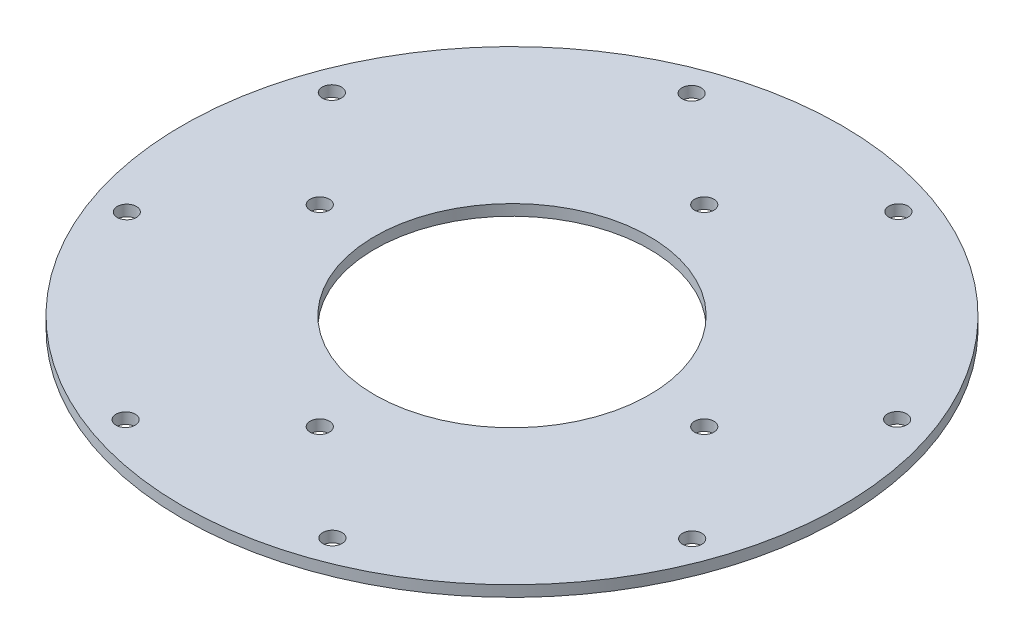
ISO-10303-21;
HEADER;
FILE_DESCRIPTION(('STEP AP214'),'2;1');
FILE_NAME('part.step','',(''),(''),'','','');
FILE_SCHEMA(('AUTOMOTIVE_DESIGN { 1 0 10303 214 1 1 1 1 }'));
ENDSEC;
DATA;
#1=APPLICATION_CONTEXT('core data for automotive mechanical design processes');
#2=APPLICATION_PROTOCOL_DEFINITION('international standard','automotive_design',2000,#1);
#3=PRODUCT_CONTEXT('',#1,'mechanical');
#4=PRODUCT('Part','Part','',(#3));
#5=PRODUCT_RELATED_PRODUCT_CATEGORY('part','',(#4));
#6=PRODUCT_DEFINITION_FORMATION('','',#4);
#7=PRODUCT_DEFINITION_CONTEXT('part definition',#1,'design');
#8=PRODUCT_DEFINITION('design','',#6,#7);
#9=PRODUCT_DEFINITION_SHAPE('','',#8);
#10=(LENGTH_UNIT() NAMED_UNIT(*) SI_UNIT(.MILLI.,.METRE.));
#11=(NAMED_UNIT(*) PLANE_ANGLE_UNIT() SI_UNIT($,.RADIAN.));
#12=(NAMED_UNIT(*) SI_UNIT($,.STERADIAN.) SOLID_ANGLE_UNIT());
#13=UNCERTAINTY_MEASURE_WITH_UNIT(LENGTH_MEASURE(1.E-05),#10,'distance_accuracy_value','');
#14=(GEOMETRIC_REPRESENTATION_CONTEXT(3) GLOBAL_UNCERTAINTY_ASSIGNED_CONTEXT((#13)) GLOBAL_UNIT_ASSIGNED_CONTEXT((#10,
#11,#12)) REPRESENTATION_CONTEXT('',''));
#15=CARTESIAN_POINT('',(0.,0.,0.));
#16=DIRECTION('',(0.,0.,1.));
#17=DIRECTION('',(1.,0.,0.));
#18=AXIS2_PLACEMENT_3D('',#15,#16,#17);
#19=CARTESIAN_POINT('',(0.,2.,0.));
#20=DIRECTION('',(0.,1.,0.));
#21=DIRECTION('',(0.,0.,1.));
#22=AXIS2_PLACEMENT_3D('',#19,#20,#21);
#23=PLANE('',#22);
#24=CARTESIAN_POINT('',(0.,2.,0.));
#25=DIRECTION('',(0.,1.,0.));
#26=DIRECTION('',(0.,0.,1.));
#27=AXIS2_PLACEMENT_3D('',#24,#25,#26);
#28=CIRCLE('',#27,25.);
#29=CARTESIAN_POINT('',(0.,2.,25.));
#30=VERTEX_POINT('',#29);
#31=EDGE_CURVE('E140',#30,#30,#28,.T.);
#32=ORIENTED_EDGE('',*,*,#31,.F.);
#33=EDGE_LOOP('',(#32));
#34=FACE_BOUND('',#33,.T.);
#35=CARTESIAN_POINT('',(0.,2.,-35.));
#36=DIRECTION('',(0.,1.,0.));
#37=DIRECTION('',(0.,0.,1.));
#38=AXIS2_PLACEMENT_3D('',#35,#36,#37);
#39=CIRCLE('',#38,1.75);
#40=CARTESIAN_POINT('',(0.,2.,-33.25));
#41=VERTEX_POINT('',#40);
#42=EDGE_CURVE('E54',#41,#41,#39,.T.);
#43=ORIENTED_EDGE('',*,*,#42,.F.);
#44=EDGE_LOOP('',(#43));
#45=FACE_BOUND('',#44,.T.);
#46=CARTESIAN_POINT('',(35.000000000001,2.,-9.88330434368617E-13));
#47=DIRECTION('',(0.,1.,0.));
#48=DIRECTION('',(0.,0.,1.));
#49=AXIS2_PLACEMENT_3D('',#46,#47,#48);
#50=CIRCLE('',#49,1.75000000000077);
#51=CARTESIAN_POINT('',(35.000000000001,2.,1.74999999999978));
#52=VERTEX_POINT('',#51);
#53=EDGE_CURVE('E147',#52,#52,#50,.T.);
#54=ORIENTED_EDGE('',*,*,#53,.F.);
#55=EDGE_LOOP('',(#54));
#56=FACE_BOUND('',#55,.T.);
#57=CARTESIAN_POINT('',(1.97666086873723E-12,2.,35.));
#58=DIRECTION('',(0.,1.,0.));
#59=DIRECTION('',(0.,0.,1.));
#60=AXIS2_PLACEMENT_3D('',#57,#58,#59);
#61=CIRCLE('',#60,1.75000000000212);
#62=CARTESIAN_POINT('',(1.97666086873723E-12,2.,36.7500000000021));
#63=VERTEX_POINT('',#62);
#64=EDGE_CURVE('E151',#63,#63,#61,.T.);
#65=ORIENTED_EDGE('',*,*,#64,.F.);
#66=EDGE_LOOP('',(#65));
#67=FACE_BOUND('',#66,.T.);
#68=CARTESIAN_POINT('',(-34.999999999999,2.,9.92616698165633E-13));
#69=DIRECTION('',(0.,1.,0.));
#70=DIRECTION('',(0.,0.,1.));
#71=AXIS2_PLACEMENT_3D('',#68,#69,#70);
#72=CIRCLE('',#71,1.75000000000159);
#73=CARTESIAN_POINT('',(-34.999999999999,2.,1.75000000000258));
#74=VERTEX_POINT('',#73);
#75=EDGE_CURVE('E155',#74,#74,#72,.T.);
#76=ORIENTED_EDGE('',*,*,#75,.F.);
#77=EDGE_LOOP('',(#76));
#78=FACE_BOUND('',#77,.T.);
#79=CARTESIAN_POINT('',(-18.7721486762096,2.,51.576054602529));
#80=DIRECTION('',(0.,1.,0.));
#81=DIRECTION('',(0.,0.,1.));
#82=AXIS2_PLACEMENT_3D('',#79,#80,#81);
#83=CIRCLE('',#82,1.75);
#84=CARTESIAN_POINT('',(-18.7721486762096,2.,53.326054602529));
#85=VERTEX_POINT('',#84);
#86=EDGE_CURVE('E74',#85,#85,#83,.T.);
#87=ORIENTED_EDGE('',*,*,#86,.F.);
#88=EDGE_LOOP('',(#87));
#89=FACE_BOUND('',#88,.T.);
#90=CARTESIAN_POINT('',(51.576054602531,2.,18.7721486762105));
#91=DIRECTION('',(0.,1.,0.));
#92=DIRECTION('',(0.,0.,1.));
#93=AXIS2_PLACEMENT_3D('',#90,#91,#92);
#94=CIRCLE('',#93,1.75000000000153);
#95=CARTESIAN_POINT('',(51.576054602531,2.,20.522148676212));
#96=VERTEX_POINT('',#95);
#97=EDGE_CURVE('E86',#96,#96,#94,.T.);
#98=ORIENTED_EDGE('',*,*,#97,.F.);
#99=EDGE_LOOP('',(#98));
#100=FACE_BOUND('',#99,.T.);
#101=CARTESIAN_POINT('',(18.7721486762125,2.,-51.57605460253));
#102=DIRECTION('',(0.,1.,0.));
#103=DIRECTION('',(0.,0.,1.));
#104=AXIS2_PLACEMENT_3D('',#101,#102,#103);
#105=CIRCLE('',#104,1.74999999999994);
#106=CARTESIAN_POINT('',(18.7721486762125,2.,-49.8260546025301));
#107=VERTEX_POINT('',#106);
#108=EDGE_CURVE('E98',#107,#107,#105,.T.);
#109=ORIENTED_EDGE('',*,*,#108,.F.);
#110=EDGE_LOOP('',(#109));
#111=FACE_BOUND('',#110,.T.);
#112=CARTESIAN_POINT('',(-51.5760546025281,2.,-18.7721486762116));
#113=DIRECTION('',(0.,1.,0.));
#114=DIRECTION('',(0.,0.,1.));
#115=AXIS2_PLACEMENT_3D('',#112,#113,#114);
#116=CIRCLE('',#115,1.74999999999817);
#117=CARTESIAN_POINT('',(-51.5760546025281,2.,-17.0221486762134));
#118=VERTEX_POINT('',#117);
#119=EDGE_CURVE('E44',#118,#118,#116,.T.);
#120=ORIENTED_EDGE('',*,*,#119,.F.);
#121=EDGE_LOOP('',(#120));
#122=FACE_BOUND('',#121,.T.);
#123=CARTESIAN_POINT('',(0.,2.,0.));
#124=DIRECTION('',(0.,1.,0.));
#125=DIRECTION('',(0.,0.,1.));
#126=AXIS2_PLACEMENT_3D('',#123,#124,#125);
#127=CIRCLE('',#126,60.);
#128=CARTESIAN_POINT('',(0.,2.,60.));
#129=VERTEX_POINT('',#128);
#130=EDGE_CURVE('E10',#129,#129,#127,.T.);
#131=ORIENTED_EDGE('',*,*,#130,.T.);
#132=EDGE_LOOP('',(#131));
#133=FACE_BOUND('',#132,.T.);
#134=CARTESIAN_POINT('',(-18.7123480321497,2.,-51.4117536833079));
#135=DIRECTION('',(0.,1.,0.));
#136=DIRECTION('',(0.,0.,1.));
#137=AXIS2_PLACEMENT_3D('',#134,#135,#136);
#138=CIRCLE('',#137,1.75);
#139=CARTESIAN_POINT('',(-18.7123480321497,2.,-49.6617536833079));
#140=VERTEX_POINT('',#139);
#141=EDGE_CURVE('E104',#140,#140,#138,.T.);
#142=ORIENTED_EDGE('',*,*,#141,.F.);
#143=EDGE_LOOP('',(#142));
#144=FACE_BOUND('',#143,.T.);
#145=CARTESIAN_POINT('',(51.4117536833088,2.,-18.7123480321517));
#146=DIRECTION('',(0.,1.,0.));
#147=DIRECTION('',(0.,0.,1.));
#148=AXIS2_PLACEMENT_3D('',#145,#146,#147);
#149=CIRCLE('',#148,1.75000000000184);
#150=CARTESIAN_POINT('',(51.4117536833088,2.,-16.9623480321499));
#151=VERTEX_POINT('',#150);
#152=EDGE_CURVE('E92',#151,#151,#149,.T.);
#153=ORIENTED_EDGE('',*,*,#152,.F.);
#154=EDGE_LOOP('',(#153));
#155=FACE_BOUND('',#154,.T.);
#156=CARTESIAN_POINT('',(18.7123480321527,2.,51.4117536833068));
#157=DIRECTION('',(0.,1.,0.));
#158=DIRECTION('',(0.,0.,1.));
#159=AXIS2_PLACEMENT_3D('',#156,#157,#158);
#160=CIRCLE('',#159,1.75000000000352);
#161=CARTESIAN_POINT('',(18.7123480321527,2.,53.1617536833103));
#162=VERTEX_POINT('',#161);
#163=EDGE_CURVE('E80',#162,#162,#160,.T.);
#164=ORIENTED_EDGE('',*,*,#163,.F.);
#165=EDGE_LOOP('',(#164));
#166=FACE_BOUND('',#165,.T.);
#167=CARTESIAN_POINT('',(-51.4117536833059,2.,18.7123480321507));
#168=DIRECTION('',(0.,1.,0.));
#169=DIRECTION('',(0.,0.,1.));
#170=AXIS2_PLACEMENT_3D('',#167,#168,#169);
#171=CIRCLE('',#170,1.75000000000206);
#172=CARTESIAN_POINT('',(-51.4117536833059,2.,20.4623480321527));
#173=VERTEX_POINT('',#172);
#174=EDGE_CURVE('E65',#173,#173,#171,.T.);
#175=ORIENTED_EDGE('',*,*,#174,.F.);
#176=EDGE_LOOP('',(#175));
#177=FACE_BOUND('',#176,.T.);
#178=ADVANCED_FACE('F31',(#34,#45,#56,#67,#78,#89,#100,#111,#122,#133,#144,#155,#166,#177),#23,.T.);
#179=CARTESIAN_POINT('',(0.,0.,0.));
#180=DIRECTION('',(0.,1.,0.));
#181=DIRECTION('',(0.,0.,1.));
#182=AXIS2_PLACEMENT_3D('',#179,#180,#181);
#183=PLANE('',#182);
#184=CARTESIAN_POINT('',(0.,0.,0.));
#185=DIRECTION('',(0.,1.,0.));
#186=DIRECTION('',(0.,0.,1.));
#187=AXIS2_PLACEMENT_3D('',#184,#185,#186);
#188=CIRCLE('',#187,25.);
#189=CARTESIAN_POINT('',(0.,0.,25.));
#190=VERTEX_POINT('',#189);
#191=EDGE_CURVE('E35',#190,#190,#188,.T.);
#192=ORIENTED_EDGE('',*,*,#191,.T.);
#193=EDGE_LOOP('',(#192));
#194=FACE_BOUND('',#193,.T.);
#195=CARTESIAN_POINT('',(0.,0.,-35.));
#196=DIRECTION('',(0.,1.,0.));
#197=DIRECTION('',(0.,0.,1.));
#198=AXIS2_PLACEMENT_3D('',#195,#196,#197);
#199=CIRCLE('',#198,1.75);
#200=CARTESIAN_POINT('',(0.,0.,-33.25));
#201=VERTEX_POINT('',#200);
#202=EDGE_CURVE('E59',#201,#201,#199,.T.);
#203=ORIENTED_EDGE('',*,*,#202,.T.);
#204=EDGE_LOOP('',(#203));
#205=FACE_BOUND('',#204,.T.);
#206=CARTESIAN_POINT('',(35.000000000001,0.,-9.88330434368617E-13));
#207=DIRECTION('',(0.,1.,0.));
#208=DIRECTION('',(0.,0.,1.));
#209=AXIS2_PLACEMENT_3D('',#206,#207,#208);
#210=CIRCLE('',#209,1.75000000000077);
#211=CARTESIAN_POINT('',(35.000000000001,0.,1.74999999999978));
#212=VERTEX_POINT('',#211);
#213=EDGE_CURVE('E57',#212,#212,#210,.T.);
#214=ORIENTED_EDGE('',*,*,#213,.T.);
#215=EDGE_LOOP('',(#214));
#216=FACE_BOUND('',#215,.T.);
#217=CARTESIAN_POINT('',(1.97666086873723E-12,0.,35.));
#218=DIRECTION('',(0.,1.,0.));
#219=DIRECTION('',(0.,0.,1.));
#220=AXIS2_PLACEMENT_3D('',#217,#218,#219);
#221=CIRCLE('',#220,1.75000000000212);
#222=CARTESIAN_POINT('',(1.97666086873723E-12,0.,36.7500000000021));
#223=VERTEX_POINT('',#222);
#224=EDGE_CURVE('E53',#223,#223,#221,.T.);
#225=ORIENTED_EDGE('',*,*,#224,.T.);
#226=EDGE_LOOP('',(#225));
#227=FACE_BOUND('',#226,.T.);
#228=CARTESIAN_POINT('',(-34.999999999999,0.,9.92616698165633E-13));
#229=DIRECTION('',(0.,1.,0.));
#230=DIRECTION('',(0.,0.,1.));
#231=AXIS2_PLACEMENT_3D('',#228,#229,#230);
#232=CIRCLE('',#231,1.75000000000159);
#233=CARTESIAN_POINT('',(-34.999999999999,0.,1.75000000000258));
#234=VERTEX_POINT('',#233);
#235=EDGE_CURVE('E50',#234,#234,#232,.T.);
#236=ORIENTED_EDGE('',*,*,#235,.T.);
#237=EDGE_LOOP('',(#236));
#238=FACE_BOUND('',#237,.T.);
#239=CARTESIAN_POINT('',(0.,0.,0.));
#240=DIRECTION('',(0.,1.,0.));
#241=DIRECTION('',(0.,0.,1.));
#242=AXIS2_PLACEMENT_3D('',#239,#240,#241);
#243=CIRCLE('',#242,60.);
#244=CARTESIAN_POINT('',(0.,0.,60.));
#245=VERTEX_POINT('',#244);
#246=EDGE_CURVE('E39',#245,#245,#243,.T.);
#247=ORIENTED_EDGE('',*,*,#246,.F.);
#248=EDGE_LOOP('',(#247));
#249=FACE_BOUND('',#248,.T.);
#250=CARTESIAN_POINT('',(-51.5760546025281,0.,-18.7721486762116));
#251=DIRECTION('',(0.,1.,0.));
#252=DIRECTION('',(0.,0.,1.));
#253=AXIS2_PLACEMENT_3D('',#250,#251,#252);
#254=CIRCLE('',#253,1.74999999999817);
#255=CARTESIAN_POINT('',(-51.5760546025281,0.,-17.0221486762134));
#256=VERTEX_POINT('',#255);
#257=EDGE_CURVE('E47',#256,#256,#254,.T.);
#258=ORIENTED_EDGE('',*,*,#257,.T.);
#259=EDGE_LOOP('',(#258));
#260=FACE_BOUND('',#259,.T.);
#261=CARTESIAN_POINT('',(-18.7123480321497,0.,-51.4117536833079));
#262=DIRECTION('',(0.,1.,0.));
#263=DIRECTION('',(0.,0.,1.));
#264=AXIS2_PLACEMENT_3D('',#261,#262,#263);
#265=CIRCLE('',#264,1.75);
#266=CARTESIAN_POINT('',(-18.7123480321497,0.,-49.6617536833079));
#267=VERTEX_POINT('',#266);
#268=EDGE_CURVE('E101',#267,#267,#265,.T.);
#269=ORIENTED_EDGE('',*,*,#268,.T.);
#270=EDGE_LOOP('',(#269));
#271=FACE_BOUND('',#270,.T.);
#272=CARTESIAN_POINT('',(18.7721486762125,0.,-51.57605460253));
#273=DIRECTION('',(0.,1.,0.));
#274=DIRECTION('',(0.,0.,1.));
#275=AXIS2_PLACEMENT_3D('',#272,#273,#274);
#276=CIRCLE('',#275,1.74999999999994);
#277=CARTESIAN_POINT('',(18.7721486762125,0.,-49.8260546025301));
#278=VERTEX_POINT('',#277);
#279=EDGE_CURVE('E95',#278,#278,#276,.T.);
#280=ORIENTED_EDGE('',*,*,#279,.T.);
#281=EDGE_LOOP('',(#280));
#282=FACE_BOUND('',#281,.T.);
#283=CARTESIAN_POINT('',(51.4117536833088,0.,-18.7123480321517));
#284=DIRECTION('',(0.,1.,0.));
#285=DIRECTION('',(0.,0.,1.));
#286=AXIS2_PLACEMENT_3D('',#283,#284,#285);
#287=CIRCLE('',#286,1.75000000000184);
#288=CARTESIAN_POINT('',(51.4117536833088,0.,-16.9623480321499));
#289=VERTEX_POINT('',#288);
#290=EDGE_CURVE('E89',#289,#289,#287,.T.);
#291=ORIENTED_EDGE('',*,*,#290,.T.);
#292=EDGE_LOOP('',(#291));
#293=FACE_BOUND('',#292,.T.);
#294=CARTESIAN_POINT('',(51.576054602531,0.,18.7721486762105));
#295=DIRECTION('',(0.,1.,0.));
#296=DIRECTION('',(0.,0.,1.));
#297=AXIS2_PLACEMENT_3D('',#294,#295,#296);
#298=CIRCLE('',#297,1.75000000000153);
#299=CARTESIAN_POINT('',(51.576054602531,0.,20.522148676212));
#300=VERTEX_POINT('',#299);
#301=EDGE_CURVE('E83',#300,#300,#298,.T.);
#302=ORIENTED_EDGE('',*,*,#301,.T.);
#303=EDGE_LOOP('',(#302));
#304=FACE_BOUND('',#303,.T.);
#305=CARTESIAN_POINT('',(18.7123480321527,0.,51.4117536833068));
#306=DIRECTION('',(0.,1.,0.));
#307=DIRECTION('',(0.,0.,1.));
#308=AXIS2_PLACEMENT_3D('',#305,#306,#307);
#309=CIRCLE('',#308,1.75000000000352);
#310=CARTESIAN_POINT('',(18.7123480321527,0.,53.1617536833103));
#311=VERTEX_POINT('',#310);
#312=EDGE_CURVE('E77',#311,#311,#309,.T.);
#313=ORIENTED_EDGE('',*,*,#312,.T.);
#314=EDGE_LOOP('',(#313));
#315=FACE_BOUND('',#314,.T.);
#316=CARTESIAN_POINT('',(-18.7721486762096,0.,51.576054602529));
#317=DIRECTION('',(0.,1.,0.));
#318=DIRECTION('',(0.,0.,1.));
#319=AXIS2_PLACEMENT_3D('',#316,#317,#318);
#320=CIRCLE('',#319,1.75);
#321=CARTESIAN_POINT('',(-18.7721486762096,0.,53.326054602529));
#322=VERTEX_POINT('',#321);
#323=EDGE_CURVE('E70',#322,#322,#320,.T.);
#324=ORIENTED_EDGE('',*,*,#323,.T.);
#325=EDGE_LOOP('',(#324));
#326=FACE_BOUND('',#325,.T.);
#327=CARTESIAN_POINT('',(-51.4117536833059,0.,18.7123480321507));
#328=DIRECTION('',(0.,1.,0.));
#329=DIRECTION('',(0.,0.,1.));
#330=AXIS2_PLACEMENT_3D('',#327,#328,#329);
#331=CIRCLE('',#330,1.75000000000206);
#332=CARTESIAN_POINT('',(-51.4117536833059,0.,20.4623480321527));
#333=VERTEX_POINT('',#332);
#334=EDGE_CURVE('E61',#333,#333,#331,.T.);
#335=ORIENTED_EDGE('',*,*,#334,.T.);
#336=EDGE_LOOP('',(#335));
#337=FACE_BOUND('',#336,.T.);
#338=ADVANCED_FACE('F114',(#194,#205,#216,#227,#238,#249,#260,#271,#282,#293,#304,#315,#326,
#337),#183,.F.);
#339=CARTESIAN_POINT('',(0.,2.,0.));
#340=DIRECTION('',(0.,-1.,0.));
#341=DIRECTION('',(0.,0.,-1.));
#342=AXIS2_PLACEMENT_3D('',#339,#340,#341);
#343=CYLINDRICAL_SURFACE('',#342,60.);
#344=ORIENTED_EDGE('',*,*,#130,.F.);
#345=EDGE_LOOP('',(#344));
#346=FACE_BOUND('',#345,.T.);
#347=ORIENTED_EDGE('',*,*,#246,.T.);
#348=EDGE_LOOP('',(#347));
#349=FACE_BOUND('',#348,.T.);
#350=ADVANCED_FACE('F33',(#346,#349),#343,.T.);
#351=CARTESIAN_POINT('',(-51.5760546025281,2.,-18.7721486762116));
#352=DIRECTION('',(0.,-1.,0.));
#353=DIRECTION('',(0.,0.,-1.));
#354=AXIS2_PLACEMENT_3D('',#351,#352,#353);
#355=CYLINDRICAL_SURFACE('',#354,1.74999999999817);
#356=ORIENTED_EDGE('',*,*,#119,.T.);
#357=EDGE_LOOP('',(#356));
#358=FACE_BOUND('',#357,.T.);
#359=ORIENTED_EDGE('',*,*,#257,.F.);
#360=EDGE_LOOP('',(#359));
#361=FACE_BOUND('',#360,.T.);
#362=ADVANCED_FACE('F117',(#358,#361),#355,.F.);
#363=CARTESIAN_POINT('',(-18.7123480321497,2.,-51.4117536833079));
#364=DIRECTION('',(0.,-1.,0.));
#365=DIRECTION('',(0.,0.,-1.));
#366=AXIS2_PLACEMENT_3D('',#363,#364,#365);
#367=CYLINDRICAL_SURFACE('',#366,1.75);
#368=ORIENTED_EDGE('',*,*,#141,.T.);
#369=EDGE_LOOP('',(#368));
#370=FACE_BOUND('',#369,.T.);
#371=ORIENTED_EDGE('',*,*,#268,.F.);
#372=EDGE_LOOP('',(#371));
#373=FACE_BOUND('',#372,.T.);
#374=ADVANCED_FACE('F119',(#370,#373),#367,.F.);
#375=CARTESIAN_POINT('',(18.7721486762125,2.,-51.57605460253));
#376=DIRECTION('',(0.,-1.,0.));
#377=DIRECTION('',(0.,0.,-1.));
#378=AXIS2_PLACEMENT_3D('',#375,#376,#377);
#379=CYLINDRICAL_SURFACE('',#378,1.74999999999994);
#380=ORIENTED_EDGE('',*,*,#108,.T.);
#381=EDGE_LOOP('',(#380));
#382=FACE_BOUND('',#381,.T.);
#383=ORIENTED_EDGE('',*,*,#279,.F.);
#384=EDGE_LOOP('',(#383));
#385=FACE_BOUND('',#384,.T.);
#386=ADVANCED_FACE('F125',(#382,#385),#379,.F.);
#387=CARTESIAN_POINT('',(51.4117536833088,2.,-18.7123480321517));
#388=DIRECTION('',(0.,-1.,0.));
#389=DIRECTION('',(0.,0.,-1.));
#390=AXIS2_PLACEMENT_3D('',#387,#388,#389);
#391=CYLINDRICAL_SURFACE('',#390,1.75000000000184);
#392=ORIENTED_EDGE('',*,*,#152,.T.);
#393=EDGE_LOOP('',(#392));
#394=FACE_BOUND('',#393,.T.);
#395=ORIENTED_EDGE('',*,*,#290,.F.);
#396=EDGE_LOOP('',(#395));
#397=FACE_BOUND('',#396,.T.);
#398=ADVANCED_FACE('F195',(#394,#397),#391,.F.);
#399=CARTESIAN_POINT('',(51.576054602531,2.,18.7721486762105));
#400=DIRECTION('',(0.,-1.,0.));
#401=DIRECTION('',(0.,0.,-1.));
#402=AXIS2_PLACEMENT_3D('',#399,#400,#401);
#403=CYLINDRICAL_SURFACE('',#402,1.75000000000153);
#404=ORIENTED_EDGE('',*,*,#97,.T.);
#405=EDGE_LOOP('',(#404));
#406=FACE_BOUND('',#405,.T.);
#407=ORIENTED_EDGE('',*,*,#301,.F.);
#408=EDGE_LOOP('',(#407));
#409=FACE_BOUND('',#408,.T.);
#410=ADVANCED_FACE('F191',(#406,#409),#403,.F.);
#411=CARTESIAN_POINT('',(18.7123480321527,2.,51.4117536833068));
#412=DIRECTION('',(0.,-1.,0.));
#413=DIRECTION('',(0.,0.,-1.));
#414=AXIS2_PLACEMENT_3D('',#411,#412,#413);
#415=CYLINDRICAL_SURFACE('',#414,1.75000000000352);
#416=ORIENTED_EDGE('',*,*,#163,.T.);
#417=EDGE_LOOP('',(#416));
#418=FACE_BOUND('',#417,.T.);
#419=ORIENTED_EDGE('',*,*,#312,.F.);
#420=EDGE_LOOP('',(#419));
#421=FACE_BOUND('',#420,.T.);
#422=ADVANCED_FACE('F184',(#418,#421),#415,.F.);
#423=CARTESIAN_POINT('',(-18.7721486762096,2.,51.576054602529));
#424=DIRECTION('',(0.,-1.,0.));
#425=DIRECTION('',(0.,0.,-1.));
#426=AXIS2_PLACEMENT_3D('',#423,#424,#425);
#427=CYLINDRICAL_SURFACE('',#426,1.75);
#428=ORIENTED_EDGE('',*,*,#86,.T.);
#429=EDGE_LOOP('',(#428));
#430=FACE_BOUND('',#429,.T.);
#431=ORIENTED_EDGE('',*,*,#323,.F.);
#432=EDGE_LOOP('',(#431));
#433=FACE_BOUND('',#432,.T.);
#434=ADVANCED_FACE('F175',(#430,#433),#427,.F.);
#435=CARTESIAN_POINT('',(-51.4117536833059,2.,18.7123480321507));
#436=DIRECTION('',(0.,-1.,0.));
#437=DIRECTION('',(0.,0.,-1.));
#438=AXIS2_PLACEMENT_3D('',#435,#436,#437);
#439=CYLINDRICAL_SURFACE('',#438,1.75000000000206);
#440=ORIENTED_EDGE('',*,*,#174,.T.);
#441=EDGE_LOOP('',(#440));
#442=FACE_BOUND('',#441,.T.);
#443=ORIENTED_EDGE('',*,*,#334,.F.);
#444=EDGE_LOOP('',(#443));
#445=FACE_BOUND('',#444,.T.);
#446=ADVANCED_FACE('F171',(#442,#445),#439,.F.);
#447=CARTESIAN_POINT('',(-34.999999999999,-8.,9.92616698165633E-13));
#448=DIRECTION('',(0.,1.,0.));
#449=DIRECTION('',(0.,0.,1.));
#450=AXIS2_PLACEMENT_3D('',#447,#448,#449);
#451=CYLINDRICAL_SURFACE('',#450,1.75000000000159);
#452=ORIENTED_EDGE('',*,*,#75,.T.);
#453=EDGE_LOOP('',(#452));
#454=FACE_BOUND('',#453,.T.);
#455=ORIENTED_EDGE('',*,*,#235,.F.);
#456=EDGE_LOOP('',(#455));
#457=FACE_BOUND('',#456,.T.);
#458=ADVANCED_FACE('F174',(#454,#457),#451,.F.);
#459=CARTESIAN_POINT('',(1.97666086873723E-12,-8.,35.));
#460=DIRECTION('',(0.,1.,0.));
#461=DIRECTION('',(0.,0.,1.));
#462=AXIS2_PLACEMENT_3D('',#459,#460,#461);
#463=CYLINDRICAL_SURFACE('',#462,1.75000000000212);
#464=ORIENTED_EDGE('',*,*,#64,.T.);
#465=EDGE_LOOP('',(#464));
#466=FACE_BOUND('',#465,.T.);
#467=ORIENTED_EDGE('',*,*,#224,.F.);
#468=EDGE_LOOP('',(#467));
#469=FACE_BOUND('',#468,.T.);
#470=ADVANCED_FACE('F181',(#466,#469),#463,.F.);
#471=CARTESIAN_POINT('',(35.000000000001,-8.,-9.88330434368617E-13));
#472=DIRECTION('',(0.,1.,0.));
#473=DIRECTION('',(0.,0.,1.));
#474=AXIS2_PLACEMENT_3D('',#471,#472,#473);
#475=CYLINDRICAL_SURFACE('',#474,1.75000000000077);
#476=ORIENTED_EDGE('',*,*,#53,.T.);
#477=EDGE_LOOP('',(#476));
#478=FACE_BOUND('',#477,.T.);
#479=ORIENTED_EDGE('',*,*,#213,.F.);
#480=EDGE_LOOP('',(#479));
#481=FACE_BOUND('',#480,.T.);
#482=ADVANCED_FACE('F256',(#478,#481),#475,.F.);
#483=CARTESIAN_POINT('',(0.,-8.,-35.));
#484=DIRECTION('',(0.,1.,0.));
#485=DIRECTION('',(0.,0.,1.));
#486=AXIS2_PLACEMENT_3D('',#483,#484,#485);
#487=CYLINDRICAL_SURFACE('',#486,1.75);
#488=ORIENTED_EDGE('',*,*,#42,.T.);
#489=EDGE_LOOP('',(#488));
#490=FACE_BOUND('',#489,.T.);
#491=ORIENTED_EDGE('',*,*,#202,.F.);
#492=EDGE_LOOP('',(#491));
#493=FACE_BOUND('',#492,.T.);
#494=ADVANCED_FACE('F264',(#490,#493),#487,.F.);
#495=CARTESIAN_POINT('',(0.,-8.,0.));
#496=DIRECTION('',(0.,1.,0.));
#497=DIRECTION('',(0.,0.,1.));
#498=AXIS2_PLACEMENT_3D('',#495,#496,#497);
#499=CYLINDRICAL_SURFACE('',#498,25.);
#500=ORIENTED_EDGE('',*,*,#31,.T.);
#501=EDGE_LOOP('',(#500));
#502=FACE_BOUND('',#501,.T.);
#503=ORIENTED_EDGE('',*,*,#191,.F.);
#504=EDGE_LOOP('',(#503));
#505=FACE_BOUND('',#504,.T.);
#506=ADVANCED_FACE('F273',(#502,#505),#499,.F.);
#507=CLOSED_SHELL('',(#178,#338,#350,#362,#374,#386,#398,#410,#422,#434,#446,#458,#470,#482,
#494,#506));
#508=MANIFOLD_SOLID_BREP('B2',#507);
#509=ADVANCED_BREP_SHAPE_REPRESENTATION('',(#18,#508),#14);
#510=SHAPE_DEFINITION_REPRESENTATION(#9,#509);
ENDSEC;
END-ISO-10303-21;
